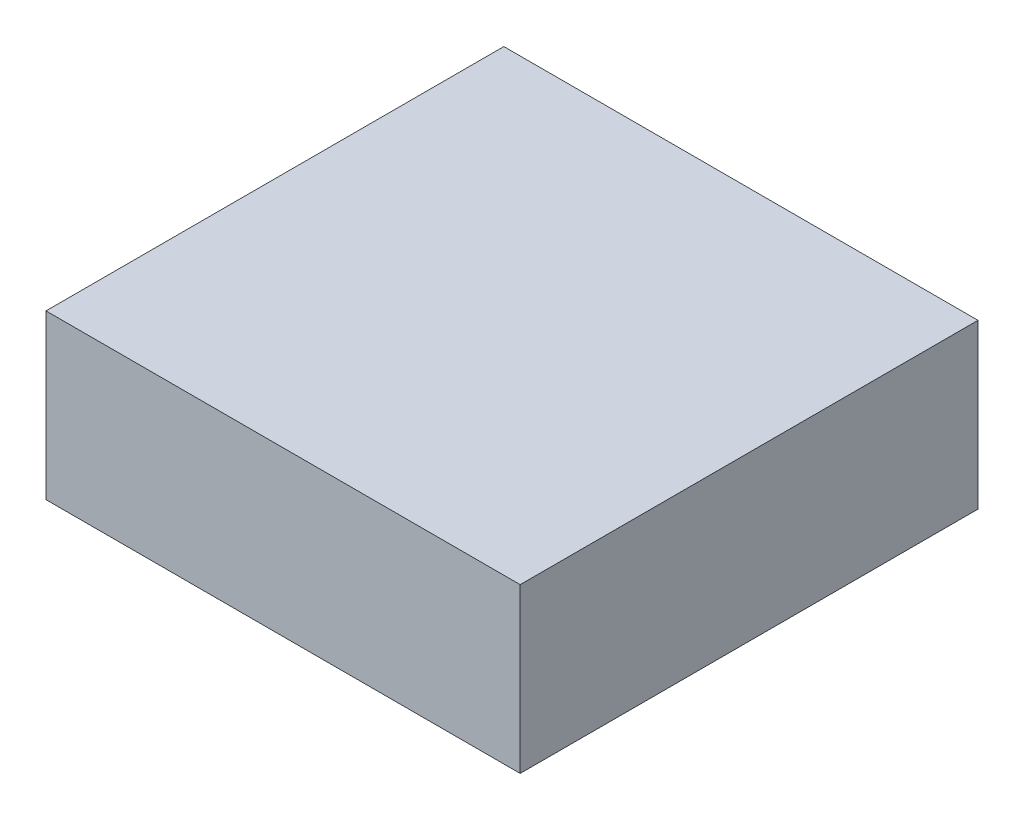
ISO-10303-21;
HEADER;
FILE_DESCRIPTION(('STEP AP214'),'2;1');
FILE_NAME('part.step','',(''),(''),'','','');
FILE_SCHEMA(('AUTOMOTIVE_DESIGN { 1 0 10303 214 1 1 1 1 }'));
ENDSEC;
DATA;
#1=APPLICATION_CONTEXT('core data for automotive mechanical design processes');
#2=APPLICATION_PROTOCOL_DEFINITION('international standard','automotive_design',2000,#1);
#3=PRODUCT_CONTEXT('',#1,'mechanical');
#4=PRODUCT('Part','Part','',(#3));
#5=PRODUCT_RELATED_PRODUCT_CATEGORY('part','',(#4));
#6=PRODUCT_DEFINITION_FORMATION('','',#4);
#7=PRODUCT_DEFINITION_CONTEXT('part definition',#1,'design');
#8=PRODUCT_DEFINITION('design','',#6,#7);
#9=PRODUCT_DEFINITION_SHAPE('','',#8);
#10=(LENGTH_UNIT() NAMED_UNIT(*) SI_UNIT(.MILLI.,.METRE.));
#11=(NAMED_UNIT(*) PLANE_ANGLE_UNIT() SI_UNIT($,.RADIAN.));
#12=(NAMED_UNIT(*) SI_UNIT($,.STERADIAN.) SOLID_ANGLE_UNIT());
#13=UNCERTAINTY_MEASURE_WITH_UNIT(LENGTH_MEASURE(1.E-05),#10,'distance_accuracy_value','');
#14=(GEOMETRIC_REPRESENTATION_CONTEXT(3) GLOBAL_UNCERTAINTY_ASSIGNED_CONTEXT((#13)) GLOBAL_UNIT_ASSIGNED_CONTEXT((#10,
#11,#12)) REPRESENTATION_CONTEXT('',''));
#15=CARTESIAN_POINT('',(0.,0.,0.));
#16=DIRECTION('',(0.,0.,1.));
#17=DIRECTION('',(1.,0.,0.));
#18=AXIS2_PLACEMENT_3D('',#15,#16,#17);
#19=CARTESIAN_POINT('',(0.,1.270000005598E-06,1.39999974));
#20=DIRECTION('',(0.,0.,-1.));
#21=DIRECTION('',(0.,-1.,0.));
#22=AXIS2_PLACEMENT_3D('',#19,#20,#21);
#23=PLANE('',#22);
#24=DIRECTION('',(0.,1.,0.));
#25=VECTOR('',#24,1.);
#26=CARTESIAN_POINT('',(-0.72499982,-0.2499995,1.39999974));
#27=LINE('',#26,#25);
#28=CARTESIAN_POINT('',(-0.72499982,-0.2499995,1.39999974));
#29=VERTEX_POINT('',#28);
#30=CARTESIAN_POINT('',(-0.72499982,0.25000204,1.39999974));
#31=VERTEX_POINT('',#30);
#32=EDGE_CURVE('E28',#29,#31,#27,.T.);
#33=ORIENTED_EDGE('',*,*,#32,.F.);
#34=DIRECTION('',(-1.,0.,0.));
#35=VECTOR('',#34,1.);
#36=CARTESIAN_POINT('',(0.72499982,-0.2499995,1.39999974));
#37=LINE('',#36,#35);
#38=CARTESIAN_POINT('',(0.72499982,-0.2499995,1.39999974));
#39=VERTEX_POINT('',#38);
#40=EDGE_CURVE('E72',#39,#29,#37,.T.);
#41=ORIENTED_EDGE('',*,*,#40,.F.);
#42=DIRECTION('',(0.,-1.,0.));
#43=VECTOR('',#42,1.);
#44=CARTESIAN_POINT('',(0.72499982,0.25000204,1.39999974));
#45=LINE('',#44,#43);
#46=CARTESIAN_POINT('',(0.72499982,0.25000204,1.39999974));
#47=VERTEX_POINT('',#46);
#48=EDGE_CURVE('E75',#47,#39,#45,.T.);
#49=ORIENTED_EDGE('',*,*,#48,.F.);
#50=DIRECTION('',(1.,0.,0.));
#51=VECTOR('',#50,1.);
#52=CARTESIAN_POINT('',(-0.72499982,0.25000204,1.39999974));
#53=LINE('',#52,#51);
#54=EDGE_CURVE('E113',#31,#47,#53,.T.);
#55=ORIENTED_EDGE('',*,*,#54,.F.);
#56=EDGE_LOOP('',(#33,#41,#49,#55));
#57=FACE_BOUND('',#56,.T.);
#58=ADVANCED_FACE('F17',(#57),#23,.F.);
#59=CARTESIAN_POINT('',(0.,1.270000005598E-06,0.));
#60=DIRECTION('',(0.,0.,-1.));
#61=DIRECTION('',(0.,-1.,0.));
#62=AXIS2_PLACEMENT_3D('',#59,#60,#61);
#63=PLANE('',#62);
#64=DIRECTION('',(1.,0.,0.));
#65=VECTOR('',#64,1.);
#66=CARTESIAN_POINT('',(-0.72499982,0.25000204,0.));
#67=LINE('',#66,#65);
#68=CARTESIAN_POINT('',(-0.72499982,0.25000204,0.));
#69=VERTEX_POINT('',#68);
#70=CARTESIAN_POINT('',(0.72499982,0.25000204,0.));
#71=VERTEX_POINT('',#70);
#72=EDGE_CURVE('E92',#69,#71,#67,.T.);
#73=ORIENTED_EDGE('',*,*,#72,.T.);
#74=DIRECTION('',(0.,-1.,0.));
#75=VECTOR('',#74,1.);
#76=CARTESIAN_POINT('',(0.72499982,0.25000204,0.));
#77=LINE('',#76,#75);
#78=CARTESIAN_POINT('',(0.72499982,-0.2499995,0.));
#79=VERTEX_POINT('',#78);
#80=EDGE_CURVE('E79',#71,#79,#77,.T.);
#81=ORIENTED_EDGE('',*,*,#80,.T.);
#82=DIRECTION('',(-1.,0.,0.));
#83=VECTOR('',#82,1.);
#84=CARTESIAN_POINT('',(0.72499982,-0.2499995,0.));
#85=LINE('',#84,#83);
#86=CARTESIAN_POINT('',(-0.72499982,-0.2499995,0.));
#87=VERTEX_POINT('',#86);
#88=EDGE_CURVE('E21',#79,#87,#85,.T.);
#89=ORIENTED_EDGE('',*,*,#88,.T.);
#90=DIRECTION('',(0.,1.,0.));
#91=VECTOR('',#90,1.);
#92=CARTESIAN_POINT('',(-0.72499982,-0.2499995,0.));
#93=LINE('',#92,#91);
#94=EDGE_CURVE('E11',#87,#69,#93,.T.);
#95=ORIENTED_EDGE('',*,*,#94,.T.);
#96=EDGE_LOOP('',(#73,#81,#89,#95));
#97=FACE_BOUND('',#96,.T.);
#98=ADVANCED_FACE('F19',(#97),#63,.T.);
#99=CARTESIAN_POINT('',(-0.72499982,-0.2499995,0.));
#100=DIRECTION('',(-1.,0.,0.));
#101=DIRECTION('',(0.,0.,1.));
#102=AXIS2_PLACEMENT_3D('',#99,#100,#101);
#103=PLANE('',#102);
#104=DIRECTION('',(0.,0.,1.));
#105=VECTOR('',#104,1.);
#106=CARTESIAN_POINT('',(-0.72499982,-0.2499995,0.));
#107=LINE('',#106,#105);
#108=EDGE_CURVE('E78',#87,#29,#107,.T.);
#109=ORIENTED_EDGE('',*,*,#108,.T.);
#110=ORIENTED_EDGE('',*,*,#32,.T.);
#111=DIRECTION('',(0.,0.,1.));
#112=VECTOR('',#111,1.);
#113=CARTESIAN_POINT('',(-0.72499982,0.25000204,0.));
#114=LINE('',#113,#112);
#115=EDGE_CURVE('E119',#69,#31,#114,.T.);
#116=ORIENTED_EDGE('',*,*,#115,.F.);
#117=ORIENTED_EDGE('',*,*,#94,.F.);
#118=EDGE_LOOP('',(#109,#110,#116,#117));
#119=FACE_BOUND('',#118,.T.);
#120=ADVANCED_FACE('F122',(#119),#103,.T.);
#121=CARTESIAN_POINT('',(0.72499982,-0.2499995,0.));
#122=DIRECTION('',(0.,-1.,0.));
#123=DIRECTION('',(0.,0.,-1.));
#124=AXIS2_PLACEMENT_3D('',#121,#122,#123);
#125=PLANE('',#124);
#126=DIRECTION('',(0.,0.,1.));
#127=VECTOR('',#126,1.);
#128=CARTESIAN_POINT('',(0.72499982,-0.2499995,0.));
#129=LINE('',#128,#127);
#130=EDGE_CURVE('E82',#79,#39,#129,.T.);
#131=ORIENTED_EDGE('',*,*,#130,.T.);
#132=ORIENTED_EDGE('',*,*,#40,.T.);
#133=ORIENTED_EDGE('',*,*,#108,.F.);
#134=ORIENTED_EDGE('',*,*,#88,.F.);
#135=EDGE_LOOP('',(#131,#132,#133,#134));
#136=FACE_BOUND('',#135,.T.);
#137=ADVANCED_FACE('F83',(#136),#125,.T.);
#138=CARTESIAN_POINT('',(0.72499982,0.25000204,0.));
#139=DIRECTION('',(1.,0.,0.));
#140=DIRECTION('',(0.,1.,0.));
#141=AXIS2_PLACEMENT_3D('',#138,#139,#140);
#142=PLANE('',#141);
#143=DIRECTION('',(0.,0.,1.));
#144=VECTOR('',#143,1.);
#145=CARTESIAN_POINT('',(0.72499982,0.25000204,0.));
#146=LINE('',#145,#144);
#147=EDGE_CURVE('E89',#71,#47,#146,.T.);
#148=ORIENTED_EDGE('',*,*,#147,.T.);
#149=ORIENTED_EDGE('',*,*,#48,.T.);
#150=ORIENTED_EDGE('',*,*,#130,.F.);
#151=ORIENTED_EDGE('',*,*,#80,.F.);
#152=EDGE_LOOP('',(#148,#149,#150,#151));
#153=FACE_BOUND('',#152,.T.);
#154=ADVANCED_FACE('F87',(#153),#142,.T.);
#155=CARTESIAN_POINT('',(-0.72499982,0.25000204,0.));
#156=DIRECTION('',(0.,1.,0.));
#157=DIRECTION('',(1.,0.,0.));
#158=AXIS2_PLACEMENT_3D('',#155,#156,#157);
#159=PLANE('',#158);
#160=ORIENTED_EDGE('',*,*,#115,.T.);
#161=ORIENTED_EDGE('',*,*,#54,.T.);
#162=ORIENTED_EDGE('',*,*,#147,.F.);
#163=ORIENTED_EDGE('',*,*,#72,.F.);
#164=EDGE_LOOP('',(#160,#161,#162,#163));
#165=FACE_BOUND('',#164,.T.);
#166=ADVANCED_FACE('F112',(#165),#159,.T.);
#167=CLOSED_SHELL('',(#58,#98,#120,#137,#154,#166));
#168=MANIFOLD_SOLID_BREP('B1',#167);
#169=ADVANCED_BREP_SHAPE_REPRESENTATION('',(#18,#168),#14);
#170=SHAPE_DEFINITION_REPRESENTATION(#9,#169);
ENDSEC;
END-ISO-10303-21;
